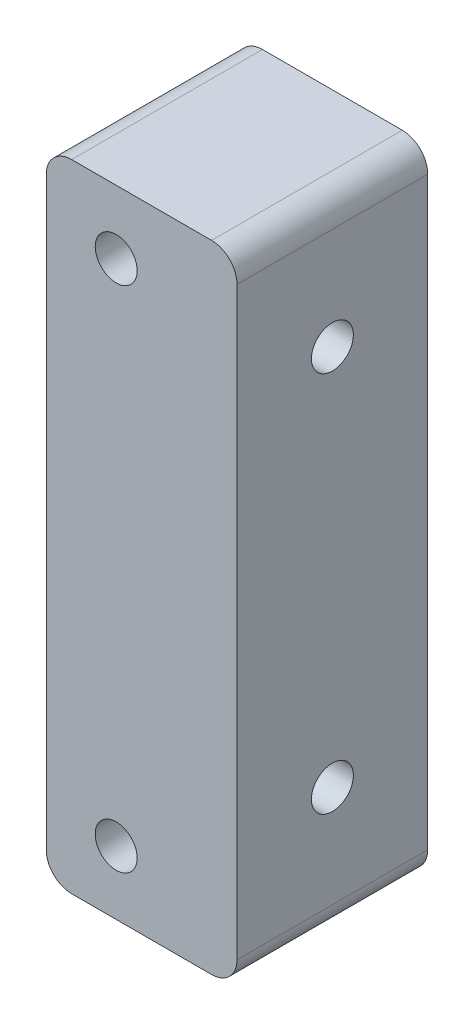
ISO-10303-21;
HEADER;
FILE_DESCRIPTION(('STEP AP214'),'2;1');
FILE_NAME('part.step','',(''),(''),'','','');
FILE_SCHEMA(('AUTOMOTIVE_DESIGN { 1 0 10303 214 1 1 1 1 }'));
ENDSEC;
DATA;
#1=APPLICATION_CONTEXT('core data for automotive mechanical design processes');
#2=APPLICATION_PROTOCOL_DEFINITION('international standard','automotive_design',2000,#1);
#3=PRODUCT_CONTEXT('',#1,'mechanical');
#4=PRODUCT('Part','Part','',(#3));
#5=PRODUCT_RELATED_PRODUCT_CATEGORY('part','',(#4));
#6=PRODUCT_DEFINITION_FORMATION('','',#4);
#7=PRODUCT_DEFINITION_CONTEXT('part definition',#1,'design');
#8=PRODUCT_DEFINITION('design','',#6,#7);
#9=PRODUCT_DEFINITION_SHAPE('','',#8);
#10=(LENGTH_UNIT() NAMED_UNIT(*) SI_UNIT(.MILLI.,.METRE.));
#11=(NAMED_UNIT(*) PLANE_ANGLE_UNIT() SI_UNIT($,.RADIAN.));
#12=(NAMED_UNIT(*) SI_UNIT($,.STERADIAN.) SOLID_ANGLE_UNIT());
#13=UNCERTAINTY_MEASURE_WITH_UNIT(LENGTH_MEASURE(1.E-05),#10,'distance_accuracy_value','');
#14=(GEOMETRIC_REPRESENTATION_CONTEXT(3) GLOBAL_UNCERTAINTY_ASSIGNED_CONTEXT((#13)) GLOBAL_UNIT_ASSIGNED_CONTEXT((#10,
#11,#12)) REPRESENTATION_CONTEXT('',''));
#15=CARTESIAN_POINT('',(0.,0.,0.));
#16=DIRECTION('',(0.,0.,1.));
#17=DIRECTION('',(1.,0.,0.));
#18=AXIS2_PLACEMENT_3D('',#15,#16,#17);
#19=CARTESIAN_POINT('',(0.,0.,15.));
#20=DIRECTION('',(0.,0.,-1.));
#21=DIRECTION('',(-1.,0.,0.));
#22=AXIS2_PLACEMENT_3D('',#19,#20,#21);
#23=PLANE('',#22);
#24=DIRECTION('',(1.,0.,0.));
#25=VECTOR('',#24,1.);
#26=CARTESIAN_POINT('',(0.,0.,15.));
#27=LINE('',#26,#25);
#28=CARTESIAN_POINT('',(2.,0.,15.));
#29=VERTEX_POINT('',#28);
#30=CARTESIAN_POINT('',(13.,0.,15.));
#31=VERTEX_POINT('',#30);
#32=EDGE_CURVE('E169',#29,#31,#27,.T.);
#33=ORIENTED_EDGE('',*,*,#32,.T.);
#34=CARTESIAN_POINT('',(13.,2.,15.));
#35=DIRECTION('',(0.,0.,-1.));
#36=DIRECTION('',(-1.,0.,0.));
#37=AXIS2_PLACEMENT_3D('',#34,#35,#36);
#38=CIRCLE('',#37,2.);
#39=CARTESIAN_POINT('',(15.,2.,15.));
#40=VERTEX_POINT('',#39);
#41=EDGE_CURVE('E149',#31,#40,#38,.F.);
#42=ORIENTED_EDGE('',*,*,#41,.T.);
#43=DIRECTION('',(0.,1.,0.));
#44=VECTOR('',#43,1.);
#45=CARTESIAN_POINT('',(15.,0.,15.));
#46=LINE('',#45,#44);
#47=CARTESIAN_POINT('',(15.,48.,15.));
#48=VERTEX_POINT('',#47);
#49=EDGE_CURVE('E119',#40,#48,#46,.T.);
#50=ORIENTED_EDGE('',*,*,#49,.T.);
#51=CARTESIAN_POINT('',(13.,48.,15.));
#52=DIRECTION('',(0.,0.,-1.));
#53=DIRECTION('',(-1.,0.,0.));
#54=AXIS2_PLACEMENT_3D('',#51,#52,#53);
#55=CIRCLE('',#54,2.);
#56=CARTESIAN_POINT('',(13.,50.,15.));
#57=VERTEX_POINT('',#56);
#58=EDGE_CURVE('E55',#48,#57,#55,.F.);
#59=ORIENTED_EDGE('',*,*,#58,.T.);
#60=DIRECTION('',(-1.,0.,0.));
#61=VECTOR('',#60,1.);
#62=CARTESIAN_POINT('',(0.,50.,15.));
#63=LINE('',#62,#61);
#64=CARTESIAN_POINT('',(2.,50.,15.));
#65=VERTEX_POINT('',#64);
#66=EDGE_CURVE('E136',#57,#65,#63,.T.);
#67=ORIENTED_EDGE('',*,*,#66,.T.);
#68=CARTESIAN_POINT('',(2.,48.,15.));
#69=DIRECTION('',(0.,0.,-1.));
#70=DIRECTION('',(-1.,0.,0.));
#71=AXIS2_PLACEMENT_3D('',#68,#69,#70);
#72=CIRCLE('',#71,2.);
#73=CARTESIAN_POINT('',(0.,48.,15.));
#74=VERTEX_POINT('',#73);
#75=EDGE_CURVE('E144',#65,#74,#72,.F.);
#76=ORIENTED_EDGE('',*,*,#75,.T.);
#77=DIRECTION('',(0.,-1.,0.));
#78=VECTOR('',#77,1.);
#79=CARTESIAN_POINT('',(0.,0.,15.));
#80=LINE('',#79,#78);
#81=CARTESIAN_POINT('',(0.,2.,15.));
#82=VERTEX_POINT('',#81);
#83=EDGE_CURVE('E130',#74,#82,#80,.T.);
#84=ORIENTED_EDGE('',*,*,#83,.T.);
#85=CARTESIAN_POINT('',(2.,2.,15.));
#86=DIRECTION('',(0.,0.,-1.));
#87=DIRECTION('',(-1.,0.,0.));
#88=AXIS2_PLACEMENT_3D('',#85,#86,#87);
#89=CIRCLE('',#88,2.);
#90=EDGE_CURVE('E147',#82,#29,#89,.F.);
#91=ORIENTED_EDGE('',*,*,#90,.T.);
#92=EDGE_LOOP('',(#33,#42,#50,#59,#67,#76,#84,#91));
#93=FACE_BOUND('',#92,.T.);
#94=CARTESIAN_POINT('',(5.5,5.,15.));
#95=DIRECTION('',(0.,0.,1.));
#96=DIRECTION('',(1.,0.,0.));
#97=AXIS2_PLACEMENT_3D('',#94,#95,#96);
#98=CIRCLE('',#97,1.65);
#99=CARTESIAN_POINT('',(7.15,5.,15.));
#100=VERTEX_POINT('',#99);
#101=EDGE_CURVE('E175',#100,#100,#98,.T.);
#102=ORIENTED_EDGE('',*,*,#101,.F.);
#103=EDGE_LOOP('',(#102));
#104=FACE_BOUND('',#103,.T.);
#105=CARTESIAN_POINT('',(5.5,45.,15.));
#106=DIRECTION('',(0.,0.,1.));
#107=DIRECTION('',(-1.,0.,0.));
#108=AXIS2_PLACEMENT_3D('',#105,#106,#107);
#109=CIRCLE('',#108,1.65);
#110=CARTESIAN_POINT('',(3.85,45.,15.));
#111=VERTEX_POINT('',#110);
#112=EDGE_CURVE('E184',#111,#111,#109,.T.);
#113=ORIENTED_EDGE('',*,*,#112,.F.);
#114=EDGE_LOOP('',(#113));
#115=FACE_BOUND('',#114,.T.);
#116=ADVANCED_FACE('F34',(#93,#104,#115),#23,.F.);
#117=CARTESIAN_POINT('',(0.,0.,0.));
#118=DIRECTION('',(0.,0.,-1.));
#119=DIRECTION('',(-1.,0.,0.));
#120=AXIS2_PLACEMENT_3D('',#117,#118,#119);
#121=PLANE('',#120);
#122=CARTESIAN_POINT('',(5.5,5.,0.));
#123=DIRECTION('',(0.,0.,1.));
#124=DIRECTION('',(1.,0.,0.));
#125=AXIS2_PLACEMENT_3D('',#122,#123,#124);
#126=CIRCLE('',#125,1.65);
#127=CARTESIAN_POINT('',(7.15,5.,0.));
#128=VERTEX_POINT('',#127);
#129=EDGE_CURVE('E177',#128,#128,#126,.T.);
#130=ORIENTED_EDGE('',*,*,#129,.T.);
#131=EDGE_LOOP('',(#130));
#132=FACE_BOUND('',#131,.T.);
#133=DIRECTION('',(0.,1.,0.));
#134=VECTOR('',#133,1.);
#135=CARTESIAN_POINT('',(15.,0.,0.));
#136=LINE('',#135,#134);
#137=CARTESIAN_POINT('',(15.,2.,0.));
#138=VERTEX_POINT('',#137);
#139=CARTESIAN_POINT('',(15.,48.,0.));
#140=VERTEX_POINT('',#139);
#141=EDGE_CURVE('E117',#138,#140,#136,.T.);
#142=ORIENTED_EDGE('',*,*,#141,.F.);
#143=CARTESIAN_POINT('',(13.,2.,0.));
#144=DIRECTION('',(0.,0.,-1.));
#145=DIRECTION('',(-1.,0.,0.));
#146=AXIS2_PLACEMENT_3D('',#143,#144,#145);
#147=CIRCLE('',#146,2.);
#148=CARTESIAN_POINT('',(13.,0.,0.));
#149=VERTEX_POINT('',#148);
#150=EDGE_CURVE('E100',#138,#149,#147,.T.);
#151=ORIENTED_EDGE('',*,*,#150,.T.);
#152=DIRECTION('',(1.,0.,0.));
#153=VECTOR('',#152,1.);
#154=CARTESIAN_POINT('',(0.,0.,0.));
#155=LINE('',#154,#153);
#156=CARTESIAN_POINT('',(2.,0.,0.));
#157=VERTEX_POINT('',#156);
#158=EDGE_CURVE('E128',#157,#149,#155,.T.);
#159=ORIENTED_EDGE('',*,*,#158,.F.);
#160=CARTESIAN_POINT('',(2.,2.,0.));
#161=DIRECTION('',(0.,0.,-1.));
#162=DIRECTION('',(-1.,0.,0.));
#163=AXIS2_PLACEMENT_3D('',#160,#161,#162);
#164=CIRCLE('',#163,2.);
#165=CARTESIAN_POINT('',(0.,2.,0.));
#166=VERTEX_POINT('',#165);
#167=EDGE_CURVE('E111',#157,#166,#164,.T.);
#168=ORIENTED_EDGE('',*,*,#167,.T.);
#169=DIRECTION('',(0.,-1.,0.));
#170=VECTOR('',#169,1.);
#171=CARTESIAN_POINT('',(0.,0.,0.));
#172=LINE('',#171,#170);
#173=CARTESIAN_POINT('',(0.,48.,0.));
#174=VERTEX_POINT('',#173);
#175=EDGE_CURVE('E132',#174,#166,#172,.T.);
#176=ORIENTED_EDGE('',*,*,#175,.F.);
#177=CARTESIAN_POINT('',(2.,48.,0.));
#178=DIRECTION('',(0.,0.,-1.));
#179=DIRECTION('',(-1.,0.,0.));
#180=AXIS2_PLACEMENT_3D('',#177,#178,#179);
#181=CIRCLE('',#180,2.);
#182=CARTESIAN_POINT('',(2.,50.,0.));
#183=VERTEX_POINT('',#182);
#184=EDGE_CURVE('E120',#174,#183,#181,.T.);
#185=ORIENTED_EDGE('',*,*,#184,.T.);
#186=DIRECTION('',(-1.,0.,0.));
#187=VECTOR('',#186,1.);
#188=CARTESIAN_POINT('',(0.,50.,0.));
#189=LINE('',#188,#187);
#190=CARTESIAN_POINT('',(13.,50.,0.));
#191=VERTEX_POINT('',#190);
#192=EDGE_CURVE('E127',#191,#183,#189,.T.);
#193=ORIENTED_EDGE('',*,*,#192,.F.);
#194=CARTESIAN_POINT('',(13.,48.,0.));
#195=DIRECTION('',(0.,0.,-1.));
#196=DIRECTION('',(-1.,0.,0.));
#197=AXIS2_PLACEMENT_3D('',#194,#195,#196);
#198=CIRCLE('',#197,2.);
#199=EDGE_CURVE('E126',#191,#140,#198,.T.);
#200=ORIENTED_EDGE('',*,*,#199,.T.);
#201=EDGE_LOOP('',(#142,#151,#159,#168,#176,#185,#193,#200));
#202=FACE_BOUND('',#201,.T.);
#203=CARTESIAN_POINT('',(5.5,45.,0.));
#204=DIRECTION('',(0.,0.,1.));
#205=DIRECTION('',(-1.,0.,0.));
#206=AXIS2_PLACEMENT_3D('',#203,#204,#205);
#207=CIRCLE('',#206,1.65);
#208=CARTESIAN_POINT('',(3.85,45.,0.));
#209=VERTEX_POINT('',#208);
#210=EDGE_CURVE('E186',#209,#209,#207,.T.);
#211=ORIENTED_EDGE('',*,*,#210,.T.);
#212=EDGE_LOOP('',(#211));
#213=FACE_BOUND('',#212,.T.);
#214=ADVANCED_FACE('F123',(#132,#202,#213),#121,.T.);
#215=CARTESIAN_POINT('',(0.,0.,15.));
#216=DIRECTION('',(1.,0.,0.));
#217=DIRECTION('',(0.,0.,-1.));
#218=AXIS2_PLACEMENT_3D('',#215,#216,#217);
#219=PLANE('',#218);
#220=CARTESIAN_POINT('',(0.,40.,7.49999999999999));
#221=DIRECTION('',(-1.,0.,0.));
#222=DIRECTION('',(0.,0.,1.));
#223=AXIS2_PLACEMENT_3D('',#220,#221,#222);
#224=CIRCLE('',#223,1.65);
#225=CARTESIAN_POINT('',(0.,40.,9.14999999999999));
#226=VERTEX_POINT('',#225);
#227=EDGE_CURVE('E195',#226,#226,#224,.T.);
#228=ORIENTED_EDGE('',*,*,#227,.F.);
#229=EDGE_LOOP('',(#228));
#230=FACE_BOUND('',#229,.T.);
#231=CARTESIAN_POINT('',(0.,10.,7.5));
#232=DIRECTION('',(-1.,0.,0.));
#233=DIRECTION('',(0.,0.,-1.));
#234=AXIS2_PLACEMENT_3D('',#231,#232,#233);
#235=CIRCLE('',#234,1.65);
#236=CARTESIAN_POINT('',(0.,10.,5.85));
#237=VERTEX_POINT('',#236);
#238=EDGE_CURVE('E196',#237,#237,#235,.T.);
#239=ORIENTED_EDGE('',*,*,#238,.F.);
#240=EDGE_LOOP('',(#239));
#241=FACE_BOUND('',#240,.T.);
#242=ORIENTED_EDGE('',*,*,#175,.T.);
#243=DIRECTION('',(0.,0.,-1.));
#244=VECTOR('',#243,1.);
#245=CARTESIAN_POINT('',(0.,2.,15.));
#246=LINE('',#245,#244);
#247=EDGE_CURVE('E154',#166,#82,#246,.F.);
#248=ORIENTED_EDGE('',*,*,#247,.T.);
#249=ORIENTED_EDGE('',*,*,#83,.F.);
#250=DIRECTION('',(0.,0.,-1.));
#251=VECTOR('',#250,1.);
#252=CARTESIAN_POINT('',(0.,48.,15.));
#253=LINE('',#252,#251);
#254=EDGE_CURVE('E151',#74,#174,#253,.T.);
#255=ORIENTED_EDGE('',*,*,#254,.T.);
#256=EDGE_LOOP('',(#242,#248,#249,#255));
#257=FACE_BOUND('',#256,.T.);
#258=ADVANCED_FACE('F160',(#230,#241,#257),#219,.F.);
#259=CARTESIAN_POINT('',(0.,0.,15.));
#260=DIRECTION('',(0.,1.,0.));
#261=DIRECTION('',(0.,0.,1.));
#262=AXIS2_PLACEMENT_3D('',#259,#260,#261);
#263=PLANE('',#262);
#264=ORIENTED_EDGE('',*,*,#158,.T.);
#265=DIRECTION('',(0.,0.,-1.));
#266=VECTOR('',#265,1.);
#267=CARTESIAN_POINT('',(13.,0.,15.));
#268=LINE('',#267,#266);
#269=EDGE_CURVE('E105',#149,#31,#268,.F.);
#270=ORIENTED_EDGE('',*,*,#269,.T.);
#271=ORIENTED_EDGE('',*,*,#32,.F.);
#272=DIRECTION('',(0.,0.,-1.));
#273=VECTOR('',#272,1.);
#274=CARTESIAN_POINT('',(2.,0.,15.));
#275=LINE('',#274,#273);
#276=EDGE_CURVE('E110',#29,#157,#275,.T.);
#277=ORIENTED_EDGE('',*,*,#276,.T.);
#278=EDGE_LOOP('',(#264,#270,#271,#277));
#279=FACE_BOUND('',#278,.T.);
#280=ADVANCED_FACE('F174',(#279),#263,.F.);
#281=CARTESIAN_POINT('',(15.,0.,15.));
#282=DIRECTION('',(-1.,0.,0.));
#283=DIRECTION('',(0.,0.,1.));
#284=AXIS2_PLACEMENT_3D('',#281,#282,#283);
#285=PLANE('',#284);
#286=CARTESIAN_POINT('',(15.,40.,7.49999999999999));
#287=DIRECTION('',(-1.,0.,0.));
#288=DIRECTION('',(0.,0.,1.));
#289=AXIS2_PLACEMENT_3D('',#286,#287,#288);
#290=CIRCLE('',#289,1.65);
#291=CARTESIAN_POINT('',(15.,40.,9.14999999999999));
#292=VERTEX_POINT('',#291);
#293=EDGE_CURVE('E189',#292,#292,#290,.F.);
#294=ORIENTED_EDGE('',*,*,#293,.F.);
#295=EDGE_LOOP('',(#294));
#296=FACE_BOUND('',#295,.T.);
#297=CARTESIAN_POINT('',(15.,10.,7.5));
#298=DIRECTION('',(-1.,0.,0.));
#299=DIRECTION('',(0.,0.,1.));
#300=AXIS2_PLACEMENT_3D('',#297,#298,#299);
#301=CIRCLE('',#300,1.65);
#302=CARTESIAN_POINT('',(15.,10.,9.15));
#303=VERTEX_POINT('',#302);
#304=EDGE_CURVE('E192',#303,#303,#301,.F.);
#305=ORIENTED_EDGE('',*,*,#304,.F.);
#306=EDGE_LOOP('',(#305));
#307=FACE_BOUND('',#306,.T.);
#308=ORIENTED_EDGE('',*,*,#49,.F.);
#309=DIRECTION('',(0.,0.,-1.));
#310=VECTOR('',#309,1.);
#311=CARTESIAN_POINT('',(15.,2.,15.));
#312=LINE('',#311,#310);
#313=EDGE_CURVE('E104',#40,#138,#312,.T.);
#314=ORIENTED_EDGE('',*,*,#313,.T.);
#315=ORIENTED_EDGE('',*,*,#141,.T.);
#316=DIRECTION('',(0.,0.,-1.));
#317=VECTOR('',#316,1.);
#318=CARTESIAN_POINT('',(15.,48.,15.));
#319=LINE('',#318,#317);
#320=EDGE_CURVE('E121',#140,#48,#319,.F.);
#321=ORIENTED_EDGE('',*,*,#320,.T.);
#322=EDGE_LOOP('',(#308,#314,#315,#321));
#323=FACE_BOUND('',#322,.T.);
#324=ADVANCED_FACE('F116',(#296,#307,#323),#285,.F.);
#325=CARTESIAN_POINT('',(0.,50.,15.));
#326=DIRECTION('',(0.,-1.,0.));
#327=DIRECTION('',(0.,0.,-1.));
#328=AXIS2_PLACEMENT_3D('',#325,#326,#327);
#329=PLANE('',#328);
#330=ORIENTED_EDGE('',*,*,#66,.F.);
#331=DIRECTION('',(0.,0.,-1.));
#332=VECTOR('',#331,1.);
#333=CARTESIAN_POINT('',(13.,50.,15.));
#334=LINE('',#333,#332);
#335=EDGE_CURVE('E11',#57,#191,#334,.T.);
#336=ORIENTED_EDGE('',*,*,#335,.T.);
#337=ORIENTED_EDGE('',*,*,#192,.T.);
#338=DIRECTION('',(0.,0.,-1.));
#339=VECTOR('',#338,1.);
#340=CARTESIAN_POINT('',(2.,50.,15.));
#341=LINE('',#340,#339);
#342=EDGE_CURVE('E42',#183,#65,#341,.F.);
#343=ORIENTED_EDGE('',*,*,#342,.T.);
#344=EDGE_LOOP('',(#330,#336,#337,#343));
#345=FACE_BOUND('',#344,.T.);
#346=ADVANCED_FACE('F234',(#345),#329,.F.);
#347=CARTESIAN_POINT('',(5.5,5.,15.));
#348=DIRECTION('',(0.,0.,-1.));
#349=DIRECTION('',(-1.,0.,0.));
#350=AXIS2_PLACEMENT_3D('',#347,#348,#349);
#351=CYLINDRICAL_SURFACE('',#350,1.65);
#352=ORIENTED_EDGE('',*,*,#101,.T.);
#353=EDGE_LOOP('',(#352));
#354=FACE_BOUND('',#353,.T.);
#355=ORIENTED_EDGE('',*,*,#129,.F.);
#356=EDGE_LOOP('',(#355));
#357=FACE_BOUND('',#356,.T.);
#358=ADVANCED_FACE('F222',(#354,#357),#351,.F.);
#359=CARTESIAN_POINT('',(5.5,45.,15.));
#360=DIRECTION('',(0.,0.,-1.));
#361=DIRECTION('',(-1.,0.,0.));
#362=AXIS2_PLACEMENT_3D('',#359,#360,#361);
#363=CYLINDRICAL_SURFACE('',#362,1.65);
#364=ORIENTED_EDGE('',*,*,#112,.T.);
#365=EDGE_LOOP('',(#364));
#366=FACE_BOUND('',#365,.T.);
#367=ORIENTED_EDGE('',*,*,#210,.F.);
#368=EDGE_LOOP('',(#367));
#369=FACE_BOUND('',#368,.T.);
#370=ADVANCED_FACE('F213',(#366,#369),#363,.F.);
#371=CARTESIAN_POINT('',(19.6669047558312,10.,7.5));
#372=DIRECTION('',(-1.,0.,0.));
#373=DIRECTION('',(0.,0.,1.));
#374=AXIS2_PLACEMENT_3D('',#371,#372,#373);
#375=CYLINDRICAL_SURFACE('',#374,1.65);
#376=ORIENTED_EDGE('',*,*,#304,.T.);
#377=EDGE_LOOP('',(#376));
#378=FACE_BOUND('',#377,.T.);
#379=ORIENTED_EDGE('',*,*,#238,.T.);
#380=EDGE_LOOP('',(#379));
#381=FACE_BOUND('',#380,.T.);
#382=ADVANCED_FACE('F211',(#378,#381),#375,.F.);
#383=CARTESIAN_POINT('',(19.6669047558312,40.,7.49999999999999));
#384=DIRECTION('',(-1.,0.,0.));
#385=DIRECTION('',(0.,0.,1.));
#386=AXIS2_PLACEMENT_3D('',#383,#384,#385);
#387=CYLINDRICAL_SURFACE('',#386,1.65);
#388=ORIENTED_EDGE('',*,*,#293,.T.);
#389=EDGE_LOOP('',(#388));
#390=FACE_BOUND('',#389,.T.);
#391=ORIENTED_EDGE('',*,*,#227,.T.);
#392=EDGE_LOOP('',(#391));
#393=FACE_BOUND('',#392,.T.);
#394=ADVANCED_FACE('F204',(#390,#393),#387,.F.);
#395=CARTESIAN_POINT('',(13.,2.,15.));
#396=DIRECTION('',(0.,0.,-1.));
#397=DIRECTION('',(-1.,0.,0.));
#398=AXIS2_PLACEMENT_3D('',#395,#396,#397);
#399=CYLINDRICAL_SURFACE('',#398,2.);
#400=ORIENTED_EDGE('',*,*,#41,.F.);
#401=ORIENTED_EDGE('',*,*,#269,.F.);
#402=ORIENTED_EDGE('',*,*,#150,.F.);
#403=ORIENTED_EDGE('',*,*,#313,.F.);
#404=EDGE_LOOP('',(#400,#401,#402,#403));
#405=FACE_BOUND('',#404,.T.);
#406=ADVANCED_FACE('F103',(#405),#399,.T.);
#407=CARTESIAN_POINT('',(2.,2.,15.));
#408=DIRECTION('',(0.,0.,-1.));
#409=DIRECTION('',(-1.,0.,0.));
#410=AXIS2_PLACEMENT_3D('',#407,#408,#409);
#411=CYLINDRICAL_SURFACE('',#410,2.);
#412=ORIENTED_EDGE('',*,*,#90,.F.);
#413=ORIENTED_EDGE('',*,*,#247,.F.);
#414=ORIENTED_EDGE('',*,*,#167,.F.);
#415=ORIENTED_EDGE('',*,*,#276,.F.);
#416=EDGE_LOOP('',(#412,#413,#414,#415));
#417=FACE_BOUND('',#416,.T.);
#418=ADVANCED_FACE('F172',(#417),#411,.T.);
#419=CARTESIAN_POINT('',(13.,48.,15.));
#420=DIRECTION('',(0.,0.,-1.));
#421=DIRECTION('',(-1.,0.,0.));
#422=AXIS2_PLACEMENT_3D('',#419,#420,#421);
#423=CYLINDRICAL_SURFACE('',#422,2.);
#424=ORIENTED_EDGE('',*,*,#58,.F.);
#425=ORIENTED_EDGE('',*,*,#320,.F.);
#426=ORIENTED_EDGE('',*,*,#199,.F.);
#427=ORIENTED_EDGE('',*,*,#335,.F.);
#428=EDGE_LOOP('',(#424,#425,#426,#427));
#429=FACE_BOUND('',#428,.T.);
#430=ADVANCED_FACE('F245',(#429),#423,.T.);
#431=CARTESIAN_POINT('',(2.,48.,15.));
#432=DIRECTION('',(0.,0.,-1.));
#433=DIRECTION('',(-1.,0.,0.));
#434=AXIS2_PLACEMENT_3D('',#431,#432,#433);
#435=CYLINDRICAL_SURFACE('',#434,2.);
#436=ORIENTED_EDGE('',*,*,#75,.F.);
#437=ORIENTED_EDGE('',*,*,#342,.F.);
#438=ORIENTED_EDGE('',*,*,#184,.F.);
#439=ORIENTED_EDGE('',*,*,#254,.F.);
#440=EDGE_LOOP('',(#436,#437,#438,#439));
#441=FACE_BOUND('',#440,.T.);
#442=ADVANCED_FACE('F36',(#441),#435,.T.);
#443=CLOSED_SHELL('',(#116,#214,#258,#280,#324,#346,#358,#370,#382,#394,#406,#418,#430,#442));
#444=MANIFOLD_SOLID_BREP('B2',#443);
#445=ADVANCED_BREP_SHAPE_REPRESENTATION('',(#18,#444),#14);
#446=SHAPE_DEFINITION_REPRESENTATION(#9,#445);
ENDSEC;
END-ISO-10303-21;
